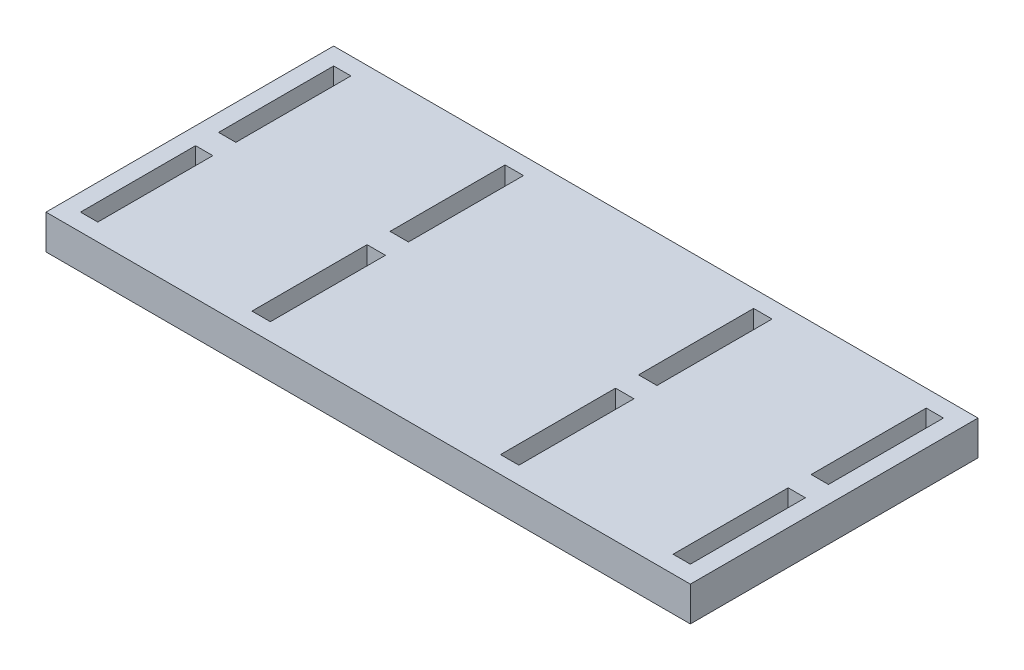
ISO-10303-21;
HEADER;
FILE_DESCRIPTION(('STEP AP214'),'2;1');
FILE_NAME('part.step','',(''),(''),'','','');
FILE_SCHEMA(('AUTOMOTIVE_DESIGN { 1 0 10303 214 1 1 1 1 }'));
ENDSEC;
DATA;
#1=APPLICATION_CONTEXT('core data for automotive mechanical design processes');
#2=APPLICATION_PROTOCOL_DEFINITION('international standard','automotive_design',2000,#1);
#3=PRODUCT_CONTEXT('',#1,'mechanical');
#4=PRODUCT('Part','Part','',(#3));
#5=PRODUCT_RELATED_PRODUCT_CATEGORY('part','',(#4));
#6=PRODUCT_DEFINITION_FORMATION('','',#4);
#7=PRODUCT_DEFINITION_CONTEXT('part definition',#1,'design');
#8=PRODUCT_DEFINITION('design','',#6,#7);
#9=PRODUCT_DEFINITION_SHAPE('','',#8);
#10=(LENGTH_UNIT() NAMED_UNIT(*) SI_UNIT(.MILLI.,.METRE.));
#11=(NAMED_UNIT(*) PLANE_ANGLE_UNIT() SI_UNIT($,.RADIAN.));
#12=(NAMED_UNIT(*) SI_UNIT($,.STERADIAN.) SOLID_ANGLE_UNIT());
#13=UNCERTAINTY_MEASURE_WITH_UNIT(LENGTH_MEASURE(1.E-05),#10,'distance_accuracy_value','');
#14=(GEOMETRIC_REPRESENTATION_CONTEXT(3) GLOBAL_UNCERTAINTY_ASSIGNED_CONTEXT((#13)) GLOBAL_UNIT_ASSIGNED_CONTEXT((#10,
#11,#12)) REPRESENTATION_CONTEXT('',''));
#15=CARTESIAN_POINT('',(0.,0.,0.));
#16=DIRECTION('',(0.,0.,1.));
#17=DIRECTION('',(1.,0.,0.));
#18=AXIS2_PLACEMENT_3D('',#15,#16,#17);
#19=CARTESIAN_POINT('',(1.01915004213638E-13,6.,47.0000000000001));
#20=DIRECTION('',(0.,0.,-1.));
#21=DIRECTION('',(-1.,0.,0.));
#22=AXIS2_PLACEMENT_3D('',#19,#20,#21);
#23=PLANE('',#22);
#24=DIRECTION('',(1.,0.,0.));
#25=VECTOR('',#24,1.);
#26=CARTESIAN_POINT('',(1.01915004213638E-13,0.,47.0000000000001));
#27=LINE('',#26,#25);
#28=CARTESIAN_POINT('',(32.8,0.,47.));
#29=VERTEX_POINT('',#28);
#30=CARTESIAN_POINT('',(36.,0.,47.));
#31=VERTEX_POINT('',#30);
#32=EDGE_CURVE('E556',#29,#31,#27,.T.);
#33=ORIENTED_EDGE('',*,*,#32,.F.);
#34=DIRECTION('',(0.,-1.,0.));
#35=VECTOR('',#34,1.);
#36=CARTESIAN_POINT('',(32.8,6.,47.));
#37=LINE('',#36,#35);
#38=CARTESIAN_POINT('',(32.8,6.,47.));
#39=VERTEX_POINT('',#38);
#40=EDGE_CURVE('E12',#39,#29,#37,.T.);
#41=ORIENTED_EDGE('',*,*,#40,.F.);
#42=DIRECTION('',(1.,0.,0.));
#43=VECTOR('',#42,1.);
#44=CARTESIAN_POINT('',(1.01915004213638E-13,6.,47.0000000000001));
#45=LINE('',#44,#43);
#46=CARTESIAN_POINT('',(36.,6.,47.));
#47=VERTEX_POINT('',#46);
#48=EDGE_CURVE('E304',#39,#47,#45,.T.);
#49=ORIENTED_EDGE('',*,*,#48,.T.);
#50=DIRECTION('',(0.,-1.,0.));
#51=VECTOR('',#50,1.);
#52=CARTESIAN_POINT('',(36.,6.,47.));
#53=LINE('',#52,#51);
#54=EDGE_CURVE('E68',#47,#31,#53,.T.);
#55=ORIENTED_EDGE('',*,*,#54,.T.);
#56=EDGE_LOOP('',(#33,#41,#49,#55));
#57=FACE_BOUND('',#56,.T.);
#58=ADVANCED_FACE('F48',(#57),#23,.T.);
#59=CARTESIAN_POINT('',(32.8,6.,0.));
#60=DIRECTION('',(-1.,0.,0.));
#61=DIRECTION('',(0.,0.,1.));
#62=AXIS2_PLACEMENT_3D('',#59,#60,#61);
#63=PLANE('',#62);
#64=DIRECTION('',(0.,0.,-1.));
#65=VECTOR('',#64,1.);
#66=CARTESIAN_POINT('',(32.8,0.,0.));
#67=LINE('',#66,#65);
#68=CARTESIAN_POINT('',(32.8,0.,27.));
#69=VERTEX_POINT('',#68);
#70=EDGE_CURVE('E310',#29,#69,#67,.T.);
#71=ORIENTED_EDGE('',*,*,#70,.T.);
#72=DIRECTION('',(0.,-1.,0.));
#73=VECTOR('',#72,1.);
#74=CARTESIAN_POINT('',(32.8,6.,27.));
#75=LINE('',#74,#73);
#76=CARTESIAN_POINT('',(32.8,6.,27.));
#77=VERTEX_POINT('',#76);
#78=EDGE_CURVE('E59',#77,#69,#75,.T.);
#79=ORIENTED_EDGE('',*,*,#78,.F.);
#80=DIRECTION('',(0.,0.,-1.));
#81=VECTOR('',#80,1.);
#82=CARTESIAN_POINT('',(32.8,6.,0.));
#83=LINE('',#82,#81);
#84=EDGE_CURVE('E299',#39,#77,#83,.T.);
#85=ORIENTED_EDGE('',*,*,#84,.F.);
#86=ORIENTED_EDGE('',*,*,#40,.T.);
#87=EDGE_LOOP('',(#71,#79,#85,#86));
#88=FACE_BOUND('',#87,.T.);
#89=ADVANCED_FACE('F308',(#88),#63,.F.);
#90=CARTESIAN_POINT('',(0.,6.,27.));
#91=DIRECTION('',(0.,0.,-1.));
#92=DIRECTION('',(-1.,0.,0.));
#93=AXIS2_PLACEMENT_3D('',#90,#91,#92);
#94=PLANE('',#93);
#95=DIRECTION('',(1.,0.,0.));
#96=VECTOR('',#95,1.);
#97=CARTESIAN_POINT('',(0.,0.,27.));
#98=LINE('',#97,#96);
#99=CARTESIAN_POINT('',(36.,0.,27.));
#100=VERTEX_POINT('',#99);
#101=EDGE_CURVE('E561',#69,#100,#98,.T.);
#102=ORIENTED_EDGE('',*,*,#101,.T.);
#103=DIRECTION('',(0.,-1.,0.));
#104=VECTOR('',#103,1.);
#105=CARTESIAN_POINT('',(36.,6.,27.));
#106=LINE('',#105,#104);
#107=CARTESIAN_POINT('',(36.,6.,27.));
#108=VERTEX_POINT('',#107);
#109=EDGE_CURVE('E178',#108,#100,#106,.T.);
#110=ORIENTED_EDGE('',*,*,#109,.F.);
#111=DIRECTION('',(1.,0.,0.));
#112=VECTOR('',#111,1.);
#113=CARTESIAN_POINT('',(0.,6.,27.));
#114=LINE('',#113,#112);
#115=EDGE_CURVE('E290',#77,#108,#114,.T.);
#116=ORIENTED_EDGE('',*,*,#115,.F.);
#117=ORIENTED_EDGE('',*,*,#78,.T.);
#118=EDGE_LOOP('',(#102,#110,#116,#117));
#119=FACE_BOUND('',#118,.T.);
#120=ADVANCED_FACE('F292',(#119),#94,.F.);
#121=CARTESIAN_POINT('',(0.,6.,47.));
#122=DIRECTION('',(0.,0.,-1.));
#123=DIRECTION('',(-1.,0.,0.));
#124=AXIS2_PLACEMENT_3D('',#121,#122,#123);
#125=PLANE('',#124);
#126=DIRECTION('',(1.,0.,0.));
#127=VECTOR('',#126,1.);
#128=CARTESIAN_POINT('',(0.,0.,47.));
#129=LINE('',#128,#127);
#130=CARTESIAN_POINT('',(3.,0.,47.));
#131=VERTEX_POINT('',#130);
#132=CARTESIAN_POINT('',(6.,0.,47.));
#133=VERTEX_POINT('',#132);
#134=EDGE_CURVE('E540',#131,#133,#129,.T.);
#135=ORIENTED_EDGE('',*,*,#134,.F.);
#136=DIRECTION('',(0.,-1.,0.));
#137=VECTOR('',#136,1.);
#138=CARTESIAN_POINT('',(3.,6.,47.));
#139=LINE('',#138,#137);
#140=CARTESIAN_POINT('',(3.,6.,47.));
#141=VERTEX_POINT('',#140);
#142=EDGE_CURVE('E328',#141,#131,#139,.T.);
#143=ORIENTED_EDGE('',*,*,#142,.F.);
#144=DIRECTION('',(1.,0.,0.));
#145=VECTOR('',#144,1.);
#146=CARTESIAN_POINT('',(0.,6.,47.));
#147=LINE('',#146,#145);
#148=CARTESIAN_POINT('',(6.,6.,47.));
#149=VERTEX_POINT('',#148);
#150=EDGE_CURVE('E721',#141,#149,#147,.T.);
#151=ORIENTED_EDGE('',*,*,#150,.T.);
#152=DIRECTION('',(0.,-1.,0.));
#153=VECTOR('',#152,1.);
#154=CARTESIAN_POINT('',(6.,6.,47.));
#155=LINE('',#154,#153);
#156=EDGE_CURVE('E317',#149,#133,#155,.T.);
#157=ORIENTED_EDGE('',*,*,#156,.T.);
#158=EDGE_LOOP('',(#135,#143,#151,#157));
#159=FACE_BOUND('',#158,.T.);
#160=ADVANCED_FACE('F784',(#159),#125,.T.);
#161=CARTESIAN_POINT('',(3.00000000000001,6.,0.));
#162=DIRECTION('',(-1.,0.,0.));
#163=DIRECTION('',(0.,0.,1.));
#164=AXIS2_PLACEMENT_3D('',#161,#162,#163);
#165=PLANE('',#164);
#166=DIRECTION('',(0.,0.,-1.));
#167=VECTOR('',#166,1.);
#168=CARTESIAN_POINT('',(3.00000000000001,0.,0.));
#169=LINE('',#168,#167);
#170=CARTESIAN_POINT('',(3.,0.,27.));
#171=VERTEX_POINT('',#170);
#172=EDGE_CURVE('E544',#131,#171,#169,.T.);
#173=ORIENTED_EDGE('',*,*,#172,.T.);
#174=DIRECTION('',(0.,-1.,0.));
#175=VECTOR('',#174,1.);
#176=CARTESIAN_POINT('',(3.,6.,27.));
#177=LINE('',#176,#175);
#178=CARTESIAN_POINT('',(3.,6.,27.));
#179=VERTEX_POINT('',#178);
#180=EDGE_CURVE('E324',#179,#171,#177,.T.);
#181=ORIENTED_EDGE('',*,*,#180,.F.);
#182=DIRECTION('',(0.,0.,-1.));
#183=VECTOR('',#182,1.);
#184=CARTESIAN_POINT('',(3.00000000000001,6.,0.));
#185=LINE('',#184,#183);
#186=EDGE_CURVE('E726',#141,#179,#185,.T.);
#187=ORIENTED_EDGE('',*,*,#186,.F.);
#188=ORIENTED_EDGE('',*,*,#142,.T.);
#189=EDGE_LOOP('',(#173,#181,#187,#188));
#190=FACE_BOUND('',#189,.T.);
#191=ADVANCED_FACE('F780',(#190),#165,.F.);
#192=CARTESIAN_POINT('',(0.,6.,27.));
#193=DIRECTION('',(0.,0.,-1.));
#194=DIRECTION('',(-1.,0.,0.));
#195=AXIS2_PLACEMENT_3D('',#192,#193,#194);
#196=PLANE('',#195);
#197=DIRECTION('',(1.,0.,0.));
#198=VECTOR('',#197,1.);
#199=CARTESIAN_POINT('',(0.,0.,27.));
#200=LINE('',#199,#198);
#201=CARTESIAN_POINT('',(6.,0.,27.));
#202=VERTEX_POINT('',#201);
#203=EDGE_CURVE('E548',#171,#202,#200,.T.);
#204=ORIENTED_EDGE('',*,*,#203,.T.);
#205=DIRECTION('',(0.,-1.,0.));
#206=VECTOR('',#205,1.);
#207=CARTESIAN_POINT('',(6.,6.,27.));
#208=LINE('',#207,#206);
#209=CARTESIAN_POINT('',(6.,6.,27.));
#210=VERTEX_POINT('',#209);
#211=EDGE_CURVE('E320',#210,#202,#208,.T.);
#212=ORIENTED_EDGE('',*,*,#211,.F.);
#213=DIRECTION('',(1.,0.,0.));
#214=VECTOR('',#213,1.);
#215=CARTESIAN_POINT('',(0.,6.,27.));
#216=LINE('',#215,#214);
#217=EDGE_CURVE('E734',#179,#210,#216,.T.);
#218=ORIENTED_EDGE('',*,*,#217,.F.);
#219=ORIENTED_EDGE('',*,*,#180,.T.);
#220=EDGE_LOOP('',(#204,#212,#218,#219));
#221=FACE_BOUND('',#220,.T.);
#222=ADVANCED_FACE('F776',(#221),#196,.F.);
#223=CARTESIAN_POINT('',(0.,6.,3.00000000000001));
#224=DIRECTION('',(0.,0.,1.));
#225=DIRECTION('',(1.,0.,0.));
#226=AXIS2_PLACEMENT_3D('',#223,#224,#225);
#227=PLANE('',#226);
#228=DIRECTION('',(-1.,0.,0.));
#229=VECTOR('',#228,1.);
#230=CARTESIAN_POINT('',(0.,0.,3.00000000000001));
#231=LINE('',#230,#229);
#232=CARTESIAN_POINT('',(79.2,0.,2.99999999999999));
#233=VERTEX_POINT('',#232);
#234=CARTESIAN_POINT('',(76.,0.,2.99999999999999));
#235=VERTEX_POINT('',#234);
#236=EDGE_CURVE('E524',#233,#235,#231,.T.);
#237=ORIENTED_EDGE('',*,*,#236,.F.);
#238=DIRECTION('',(0.,-1.,0.));
#239=VECTOR('',#238,1.);
#240=CARTESIAN_POINT('',(79.2,6.,2.99999999999999));
#241=LINE('',#240,#239);
#242=CARTESIAN_POINT('',(79.2,6.,2.99999999999999));
#243=VERTEX_POINT('',#242);
#244=EDGE_CURVE('E321',#243,#233,#241,.T.);
#245=ORIENTED_EDGE('',*,*,#244,.F.);
#246=DIRECTION('',(-1.,0.,0.));
#247=VECTOR('',#246,1.);
#248=CARTESIAN_POINT('',(0.,6.,3.00000000000001));
#249=LINE('',#248,#247);
#250=CARTESIAN_POINT('',(76.,6.,2.99999999999999));
#251=VERTEX_POINT('',#250);
#252=EDGE_CURVE('E700',#243,#251,#249,.T.);
#253=ORIENTED_EDGE('',*,*,#252,.T.);
#254=DIRECTION('',(0.,-1.,0.));
#255=VECTOR('',#254,1.);
#256=CARTESIAN_POINT('',(76.,6.,2.99999999999999));
#257=LINE('',#256,#255);
#258=EDGE_CURVE('E331',#251,#235,#257,.T.);
#259=ORIENTED_EDGE('',*,*,#258,.T.);
#260=EDGE_LOOP('',(#237,#245,#253,#259));
#261=FACE_BOUND('',#260,.T.);
#262=ADVANCED_FACE('F779',(#261),#227,.T.);
#263=CARTESIAN_POINT('',(79.2,6.,0.));
#264=DIRECTION('',(1.,0.,0.));
#265=DIRECTION('',(0.,0.,-1.));
#266=AXIS2_PLACEMENT_3D('',#263,#264,#265);
#267=PLANE('',#266);
#268=DIRECTION('',(0.,0.,1.));
#269=VECTOR('',#268,1.);
#270=CARTESIAN_POINT('',(79.2,0.,0.));
#271=LINE('',#270,#269);
#272=CARTESIAN_POINT('',(79.2,0.,23.));
#273=VERTEX_POINT('',#272);
#274=EDGE_CURVE('E528',#233,#273,#271,.T.);
#275=ORIENTED_EDGE('',*,*,#274,.T.);
#276=DIRECTION('',(0.,-1.,0.));
#277=VECTOR('',#276,1.);
#278=CARTESIAN_POINT('',(79.2,6.,23.));
#279=LINE('',#278,#277);
#280=CARTESIAN_POINT('',(79.2,6.,23.));
#281=VERTEX_POINT('',#280);
#282=EDGE_CURVE('E338',#281,#273,#279,.T.);
#283=ORIENTED_EDGE('',*,*,#282,.F.);
#284=DIRECTION('',(0.,0.,1.));
#285=VECTOR('',#284,1.);
#286=CARTESIAN_POINT('',(79.2,6.,0.));
#287=LINE('',#286,#285);
#288=EDGE_CURVE('E705',#243,#281,#287,.T.);
#289=ORIENTED_EDGE('',*,*,#288,.F.);
#290=ORIENTED_EDGE('',*,*,#244,.T.);
#291=EDGE_LOOP('',(#275,#283,#289,#290));
#292=FACE_BOUND('',#291,.T.);
#293=ADVANCED_FACE('F797',(#292),#267,.F.);
#294=CARTESIAN_POINT('',(0.,6.,23.));
#295=DIRECTION('',(0.,0.,1.));
#296=DIRECTION('',(1.,0.,0.));
#297=AXIS2_PLACEMENT_3D('',#294,#295,#296);
#298=PLANE('',#297);
#299=DIRECTION('',(-1.,0.,0.));
#300=VECTOR('',#299,1.);
#301=CARTESIAN_POINT('',(0.,0.,23.));
#302=LINE('',#301,#300);
#303=CARTESIAN_POINT('',(76.,0.,23.));
#304=VERTEX_POINT('',#303);
#305=EDGE_CURVE('E532',#273,#304,#302,.T.);
#306=ORIENTED_EDGE('',*,*,#305,.T.);
#307=DIRECTION('',(0.,-1.,0.));
#308=VECTOR('',#307,1.);
#309=CARTESIAN_POINT('',(76.,6.,23.));
#310=LINE('',#309,#308);
#311=CARTESIAN_POINT('',(76.,6.,23.));
#312=VERTEX_POINT('',#311);
#313=EDGE_CURVE('E334',#312,#304,#310,.T.);
#314=ORIENTED_EDGE('',*,*,#313,.F.);
#315=DIRECTION('',(-1.,0.,0.));
#316=VECTOR('',#315,1.);
#317=CARTESIAN_POINT('',(0.,6.,23.));
#318=LINE('',#317,#316);
#319=EDGE_CURVE('E713',#281,#312,#318,.T.);
#320=ORIENTED_EDGE('',*,*,#319,.F.);
#321=ORIENTED_EDGE('',*,*,#282,.T.);
#322=EDGE_LOOP('',(#306,#314,#320,#321));
#323=FACE_BOUND('',#322,.T.);
#324=ADVANCED_FACE('F793',(#323),#298,.F.);
#325=CARTESIAN_POINT('',(0.,6.,3.00000000000002));
#326=DIRECTION('',(0.,0.,1.));
#327=DIRECTION('',(1.,0.,0.));
#328=AXIS2_PLACEMENT_3D('',#325,#326,#327);
#329=PLANE('',#328);
#330=DIRECTION('',(-1.,0.,0.));
#331=VECTOR('',#330,1.);
#332=CARTESIAN_POINT('',(0.,0.,3.00000000000002));
#333=LINE('',#332,#331);
#334=CARTESIAN_POINT('',(109.,0.,2.99999999999999));
#335=VERTEX_POINT('',#334);
#336=CARTESIAN_POINT('',(106.,0.,2.99999999999999));
#337=VERTEX_POINT('',#336);
#338=EDGE_CURVE('E508',#335,#337,#333,.T.);
#339=ORIENTED_EDGE('',*,*,#338,.F.);
#340=DIRECTION('',(0.,-1.,0.));
#341=VECTOR('',#340,1.);
#342=CARTESIAN_POINT('',(109.,6.,2.99999999999999));
#343=LINE('',#342,#341);
#344=CARTESIAN_POINT('',(109.,6.,2.99999999999999));
#345=VERTEX_POINT('',#344);
#346=EDGE_CURVE('E335',#345,#335,#343,.T.);
#347=ORIENTED_EDGE('',*,*,#346,.F.);
#348=DIRECTION('',(-1.,0.,0.));
#349=VECTOR('',#348,1.);
#350=CARTESIAN_POINT('',(0.,6.,3.00000000000002));
#351=LINE('',#350,#349);
#352=CARTESIAN_POINT('',(106.,6.,2.99999999999999));
#353=VERTEX_POINT('',#352);
#354=EDGE_CURVE('E679',#345,#353,#351,.T.);
#355=ORIENTED_EDGE('',*,*,#354,.T.);
#356=DIRECTION('',(0.,-1.,0.));
#357=VECTOR('',#356,1.);
#358=CARTESIAN_POINT('',(106.,6.,2.99999999999999));
#359=LINE('',#358,#357);
#360=EDGE_CURVE('E344',#353,#337,#359,.T.);
#361=ORIENTED_EDGE('',*,*,#360,.T.);
#362=EDGE_LOOP('',(#339,#347,#355,#361));
#363=FACE_BOUND('',#362,.T.);
#364=ADVANCED_FACE('F796',(#363),#329,.T.);
#365=CARTESIAN_POINT('',(109.,6.,0.));
#366=DIRECTION('',(1.,0.,0.));
#367=DIRECTION('',(0.,0.,-1.));
#368=AXIS2_PLACEMENT_3D('',#365,#366,#367);
#369=PLANE('',#368);
#370=DIRECTION('',(0.,0.,1.));
#371=VECTOR('',#370,1.);
#372=CARTESIAN_POINT('',(109.,0.,0.));
#373=LINE('',#372,#371);
#374=CARTESIAN_POINT('',(109.,0.,23.));
#375=VERTEX_POINT('',#374);
#376=EDGE_CURVE('E512',#335,#375,#373,.T.);
#377=ORIENTED_EDGE('',*,*,#376,.T.);
#378=DIRECTION('',(0.,-1.,0.));
#379=VECTOR('',#378,1.);
#380=CARTESIAN_POINT('',(109.,6.,23.));
#381=LINE('',#380,#379);
#382=CARTESIAN_POINT('',(109.,6.,23.));
#383=VERTEX_POINT('',#382);
#384=EDGE_CURVE('E351',#383,#375,#381,.T.);
#385=ORIENTED_EDGE('',*,*,#384,.F.);
#386=DIRECTION('',(0.,0.,1.));
#387=VECTOR('',#386,1.);
#388=CARTESIAN_POINT('',(109.,6.,0.));
#389=LINE('',#388,#387);
#390=EDGE_CURVE('E684',#345,#383,#389,.T.);
#391=ORIENTED_EDGE('',*,*,#390,.F.);
#392=ORIENTED_EDGE('',*,*,#346,.T.);
#393=EDGE_LOOP('',(#377,#385,#391,#392));
#394=FACE_BOUND('',#393,.T.);
#395=ADVANCED_FACE('F813',(#394),#369,.F.);
#396=CARTESIAN_POINT('',(0.,6.,23.));
#397=DIRECTION('',(0.,0.,1.));
#398=DIRECTION('',(1.,0.,0.));
#399=AXIS2_PLACEMENT_3D('',#396,#397,#398);
#400=PLANE('',#399);
#401=DIRECTION('',(-1.,0.,0.));
#402=VECTOR('',#401,1.);
#403=CARTESIAN_POINT('',(0.,0.,23.));
#404=LINE('',#403,#402);
#405=CARTESIAN_POINT('',(106.,0.,23.));
#406=VERTEX_POINT('',#405);
#407=EDGE_CURVE('E516',#375,#406,#404,.T.);
#408=ORIENTED_EDGE('',*,*,#407,.T.);
#409=DIRECTION('',(0.,-1.,0.));
#410=VECTOR('',#409,1.);
#411=CARTESIAN_POINT('',(106.,6.,23.));
#412=LINE('',#411,#410);
#413=CARTESIAN_POINT('',(106.,6.,23.));
#414=VERTEX_POINT('',#413);
#415=EDGE_CURVE('E347',#414,#406,#412,.T.);
#416=ORIENTED_EDGE('',*,*,#415,.F.);
#417=DIRECTION('',(-1.,0.,0.));
#418=VECTOR('',#417,1.);
#419=CARTESIAN_POINT('',(0.,6.,23.));
#420=LINE('',#419,#418);
#421=EDGE_CURVE('E692',#383,#414,#420,.T.);
#422=ORIENTED_EDGE('',*,*,#421,.F.);
#423=ORIENTED_EDGE('',*,*,#384,.T.);
#424=EDGE_LOOP('',(#408,#416,#422,#423));
#425=FACE_BOUND('',#424,.T.);
#426=ADVANCED_FACE('F809',(#425),#400,.F.);
#427=CARTESIAN_POINT('',(0.,6.,27.));
#428=DIRECTION('',(0.,0.,1.));
#429=DIRECTION('',(1.,0.,0.));
#430=AXIS2_PLACEMENT_3D('',#427,#428,#429);
#431=PLANE('',#430);
#432=DIRECTION('',(-1.,0.,0.));
#433=VECTOR('',#432,1.);
#434=CARTESIAN_POINT('',(0.,0.,27.));
#435=LINE('',#434,#433);
#436=CARTESIAN_POINT('',(109.,0.,27.));
#437=VERTEX_POINT('',#436);
#438=CARTESIAN_POINT('',(106.,0.,27.));
#439=VERTEX_POINT('',#438);
#440=EDGE_CURVE('E492',#437,#439,#435,.T.);
#441=ORIENTED_EDGE('',*,*,#440,.F.);
#442=DIRECTION('',(0.,-1.,0.));
#443=VECTOR('',#442,1.);
#444=CARTESIAN_POINT('',(109.,6.,27.));
#445=LINE('',#444,#443);
#446=CARTESIAN_POINT('',(109.,6.,27.));
#447=VERTEX_POINT('',#446);
#448=EDGE_CURVE('E348',#447,#437,#445,.T.);
#449=ORIENTED_EDGE('',*,*,#448,.F.);
#450=DIRECTION('',(-1.,0.,0.));
#451=VECTOR('',#450,1.);
#452=CARTESIAN_POINT('',(0.,6.,27.));
#453=LINE('',#452,#451);
#454=CARTESIAN_POINT('',(106.,6.,27.));
#455=VERTEX_POINT('',#454);
#456=EDGE_CURVE('E658',#447,#455,#453,.T.);
#457=ORIENTED_EDGE('',*,*,#456,.T.);
#458=DIRECTION('',(0.,-1.,0.));
#459=VECTOR('',#458,1.);
#460=CARTESIAN_POINT('',(106.,6.,27.));
#461=LINE('',#460,#459);
#462=EDGE_CURVE('E357',#455,#439,#461,.T.);
#463=ORIENTED_EDGE('',*,*,#462,.T.);
#464=EDGE_LOOP('',(#441,#449,#457,#463));
#465=FACE_BOUND('',#464,.T.);
#466=ADVANCED_FACE('F812',(#465),#431,.T.);
#467=CARTESIAN_POINT('',(109.,6.,0.));
#468=DIRECTION('',(-1.,0.,0.));
#469=DIRECTION('',(0.,0.,1.));
#470=AXIS2_PLACEMENT_3D('',#467,#468,#469);
#471=PLANE('',#470);
#472=DIRECTION('',(0.,0.,-1.));
#473=VECTOR('',#472,1.);
#474=CARTESIAN_POINT('',(109.,0.,0.));
#475=LINE('',#474,#473);
#476=CARTESIAN_POINT('',(109.,0.,47.));
#477=VERTEX_POINT('',#476);
#478=EDGE_CURVE('E496',#477,#437,#475,.T.);
#479=ORIENTED_EDGE('',*,*,#478,.F.);
#480=DIRECTION('',(0.,-1.,0.));
#481=VECTOR('',#480,1.);
#482=CARTESIAN_POINT('',(109.,6.,47.));
#483=LINE('',#482,#481);
#484=CARTESIAN_POINT('',(109.,6.,47.));
#485=VERTEX_POINT('',#484);
#486=EDGE_CURVE('E365',#485,#477,#483,.T.);
#487=ORIENTED_EDGE('',*,*,#486,.F.);
#488=DIRECTION('',(0.,0.,-1.));
#489=VECTOR('',#488,1.);
#490=CARTESIAN_POINT('',(109.,6.,0.));
#491=LINE('',#490,#489);
#492=EDGE_CURVE('E663',#485,#447,#491,.T.);
#493=ORIENTED_EDGE('',*,*,#492,.T.);
#494=ORIENTED_EDGE('',*,*,#448,.T.);
#495=EDGE_LOOP('',(#479,#487,#493,#494));
#496=FACE_BOUND('',#495,.T.);
#497=ADVANCED_FACE('F829',(#496),#471,.T.);
#498=CARTESIAN_POINT('',(0.,6.,47.));
#499=DIRECTION('',(0.,0.,1.));
#500=DIRECTION('',(1.,0.,0.));
#501=AXIS2_PLACEMENT_3D('',#498,#499,#500);
#502=PLANE('',#501);
#503=DIRECTION('',(-1.,0.,0.));
#504=VECTOR('',#503,1.);
#505=CARTESIAN_POINT('',(0.,0.,47.));
#506=LINE('',#505,#504);
#507=CARTESIAN_POINT('',(106.,0.,47.));
#508=VERTEX_POINT('',#507);
#509=EDGE_CURVE('E500',#477,#508,#506,.T.);
#510=ORIENTED_EDGE('',*,*,#509,.T.);
#511=DIRECTION('',(0.,-1.,0.));
#512=VECTOR('',#511,1.);
#513=CARTESIAN_POINT('',(106.,6.,47.));
#514=LINE('',#513,#512);
#515=CARTESIAN_POINT('',(106.,6.,47.));
#516=VERTEX_POINT('',#515);
#517=EDGE_CURVE('E360',#516,#508,#514,.T.);
#518=ORIENTED_EDGE('',*,*,#517,.F.);
#519=DIRECTION('',(-1.,0.,0.));
#520=VECTOR('',#519,1.);
#521=CARTESIAN_POINT('',(0.,6.,47.));
#522=LINE('',#521,#520);
#523=EDGE_CURVE('E671',#485,#516,#522,.T.);
#524=ORIENTED_EDGE('',*,*,#523,.F.);
#525=ORIENTED_EDGE('',*,*,#486,.T.);
#526=EDGE_LOOP('',(#510,#518,#524,#525));
#527=FACE_BOUND('',#526,.T.);
#528=ADVANCED_FACE('F825',(#527),#502,.F.);
#529=CARTESIAN_POINT('',(0.,6.,27.));
#530=DIRECTION('',(0.,0.,1.));
#531=DIRECTION('',(1.,0.,0.));
#532=AXIS2_PLACEMENT_3D('',#529,#530,#531);
#533=PLANE('',#532);
#534=DIRECTION('',(-1.,0.,0.));
#535=VECTOR('',#534,1.);
#536=CARTESIAN_POINT('',(0.,0.,27.));
#537=LINE('',#536,#535);
#538=CARTESIAN_POINT('',(79.2,0.,27.));
#539=VERTEX_POINT('',#538);
#540=CARTESIAN_POINT('',(76.,0.,27.));
#541=VERTEX_POINT('',#540);
#542=EDGE_CURVE('E476',#539,#541,#537,.T.);
#543=ORIENTED_EDGE('',*,*,#542,.F.);
#544=DIRECTION('',(0.,-1.,0.));
#545=VECTOR('',#544,1.);
#546=CARTESIAN_POINT('',(79.2,6.,27.));
#547=LINE('',#546,#545);
#548=CARTESIAN_POINT('',(79.2,6.,27.));
#549=VERTEX_POINT('',#548);
#550=EDGE_CURVE('E361',#549,#539,#547,.T.);
#551=ORIENTED_EDGE('',*,*,#550,.F.);
#552=DIRECTION('',(-1.,0.,0.));
#553=VECTOR('',#552,1.);
#554=CARTESIAN_POINT('',(0.,6.,27.));
#555=LINE('',#554,#553);
#556=CARTESIAN_POINT('',(76.,6.,27.));
#557=VERTEX_POINT('',#556);
#558=EDGE_CURVE('E637',#549,#557,#555,.T.);
#559=ORIENTED_EDGE('',*,*,#558,.T.);
#560=DIRECTION('',(0.,-1.,0.));
#561=VECTOR('',#560,1.);
#562=CARTESIAN_POINT('',(76.,6.,27.));
#563=LINE('',#562,#561);
#564=EDGE_CURVE('E370',#557,#541,#563,.T.);
#565=ORIENTED_EDGE('',*,*,#564,.T.);
#566=EDGE_LOOP('',(#543,#551,#559,#565));
#567=FACE_BOUND('',#566,.T.);
#568=ADVANCED_FACE('F828',(#567),#533,.T.);
#569=CARTESIAN_POINT('',(79.2,6.,0.));
#570=DIRECTION('',(-1.,0.,0.));
#571=DIRECTION('',(0.,0.,1.));
#572=AXIS2_PLACEMENT_3D('',#569,#570,#571);
#573=PLANE('',#572);
#574=DIRECTION('',(0.,0.,-1.));
#575=VECTOR('',#574,1.);
#576=CARTESIAN_POINT('',(79.2,0.,0.));
#577=LINE('',#576,#575);
#578=CARTESIAN_POINT('',(79.2,0.,47.));
#579=VERTEX_POINT('',#578);
#580=EDGE_CURVE('E480',#579,#539,#577,.T.);
#581=ORIENTED_EDGE('',*,*,#580,.F.);
#582=DIRECTION('',(0.,-1.,0.));
#583=VECTOR('',#582,1.);
#584=CARTESIAN_POINT('',(79.2,6.,47.));
#585=LINE('',#584,#583);
#586=CARTESIAN_POINT('',(79.2,6.,47.));
#587=VERTEX_POINT('',#586);
#588=EDGE_CURVE('E378',#587,#579,#585,.T.);
#589=ORIENTED_EDGE('',*,*,#588,.F.);
#590=DIRECTION('',(0.,0.,-1.));
#591=VECTOR('',#590,1.);
#592=CARTESIAN_POINT('',(79.2,6.,0.));
#593=LINE('',#592,#591);
#594=EDGE_CURVE('E642',#587,#549,#593,.T.);
#595=ORIENTED_EDGE('',*,*,#594,.T.);
#596=ORIENTED_EDGE('',*,*,#550,.T.);
#597=EDGE_LOOP('',(#581,#589,#595,#596));
#598=FACE_BOUND('',#597,.T.);
#599=ADVANCED_FACE('F845',(#598),#573,.T.);
#600=CARTESIAN_POINT('',(0.,6.,47.));
#601=DIRECTION('',(0.,0.,1.));
#602=DIRECTION('',(1.,0.,0.));
#603=AXIS2_PLACEMENT_3D('',#600,#601,#602);
#604=PLANE('',#603);
#605=DIRECTION('',(-1.,0.,0.));
#606=VECTOR('',#605,1.);
#607=CARTESIAN_POINT('',(0.,0.,47.));
#608=LINE('',#607,#606);
#609=CARTESIAN_POINT('',(76.,0.,47.));
#610=VERTEX_POINT('',#609);
#611=EDGE_CURVE('E484',#579,#610,#608,.T.);
#612=ORIENTED_EDGE('',*,*,#611,.T.);
#613=DIRECTION('',(0.,-1.,0.));
#614=VECTOR('',#613,1.);
#615=CARTESIAN_POINT('',(76.,6.,47.));
#616=LINE('',#615,#614);
#617=CARTESIAN_POINT('',(76.,6.,47.));
#618=VERTEX_POINT('',#617);
#619=EDGE_CURVE('E373',#618,#610,#616,.T.);
#620=ORIENTED_EDGE('',*,*,#619,.F.);
#621=DIRECTION('',(-1.,0.,0.));
#622=VECTOR('',#621,1.);
#623=CARTESIAN_POINT('',(0.,6.,47.));
#624=LINE('',#623,#622);
#625=EDGE_CURVE('E650',#587,#618,#624,.T.);
#626=ORIENTED_EDGE('',*,*,#625,.F.);
#627=ORIENTED_EDGE('',*,*,#588,.T.);
#628=EDGE_LOOP('',(#612,#620,#626,#627));
#629=FACE_BOUND('',#628,.T.);
#630=ADVANCED_FACE('F841',(#629),#604,.F.);
#631=CARTESIAN_POINT('',(0.,6.,2.99999999999999));
#632=DIRECTION('',(0.,0.,-1.));
#633=DIRECTION('',(-1.,0.,0.));
#634=AXIS2_PLACEMENT_3D('',#631,#632,#633);
#635=PLANE('',#634);
#636=DIRECTION('',(1.,0.,0.));
#637=VECTOR('',#636,1.);
#638=CARTESIAN_POINT('',(0.,0.,2.99999999999999));
#639=LINE('',#638,#637);
#640=CARTESIAN_POINT('',(32.8,0.,3.));
#641=VERTEX_POINT('',#640);
#642=CARTESIAN_POINT('',(36.,0.,3.));
#643=VERTEX_POINT('',#642);
#644=EDGE_CURVE('E460',#641,#643,#639,.T.);
#645=ORIENTED_EDGE('',*,*,#644,.T.);
#646=DIRECTION('',(0.,-1.,0.));
#647=VECTOR('',#646,1.);
#648=CARTESIAN_POINT('',(36.,6.,3.));
#649=LINE('',#648,#647);
#650=CARTESIAN_POINT('',(36.,6.,3.));
#651=VERTEX_POINT('',#650);
#652=EDGE_CURVE('E374',#651,#643,#649,.T.);
#653=ORIENTED_EDGE('',*,*,#652,.F.);
#654=DIRECTION('',(1.,0.,0.));
#655=VECTOR('',#654,1.);
#656=CARTESIAN_POINT('',(0.,6.,2.99999999999999));
#657=LINE('',#656,#655);
#658=CARTESIAN_POINT('',(32.8,6.,3.));
#659=VERTEX_POINT('',#658);
#660=EDGE_CURVE('E615',#659,#651,#657,.T.);
#661=ORIENTED_EDGE('',*,*,#660,.F.);
#662=DIRECTION('',(0.,-1.,0.));
#663=VECTOR('',#662,1.);
#664=CARTESIAN_POINT('',(32.8,6.,3.));
#665=LINE('',#664,#663);
#666=EDGE_CURVE('E383',#659,#641,#665,.T.);
#667=ORIENTED_EDGE('',*,*,#666,.T.);
#668=EDGE_LOOP('',(#645,#653,#661,#667));
#669=FACE_BOUND('',#668,.T.);
#670=ADVANCED_FACE('F844',(#669),#635,.F.);
#671=CARTESIAN_POINT('',(36.,6.,0.));
#672=DIRECTION('',(1.,0.,0.));
#673=DIRECTION('',(0.,0.,-1.));
#674=AXIS2_PLACEMENT_3D('',#671,#672,#673);
#675=PLANE('',#674);
#676=DIRECTION('',(0.,0.,1.));
#677=VECTOR('',#676,1.);
#678=CARTESIAN_POINT('',(36.,0.,0.));
#679=LINE('',#678,#677);
#680=CARTESIAN_POINT('',(36.,0.,23.));
#681=VERTEX_POINT('',#680);
#682=EDGE_CURVE('E464',#643,#681,#679,.T.);
#683=ORIENTED_EDGE('',*,*,#682,.T.);
#684=DIRECTION('',(0.,-1.,0.));
#685=VECTOR('',#684,1.);
#686=CARTESIAN_POINT('',(36.,6.,23.));
#687=LINE('',#686,#685);
#688=CARTESIAN_POINT('',(36.,6.,23.));
#689=VERTEX_POINT('',#688);
#690=EDGE_CURVE('E390',#689,#681,#687,.T.);
#691=ORIENTED_EDGE('',*,*,#690,.F.);
#692=DIRECTION('',(0.,0.,1.));
#693=VECTOR('',#692,1.);
#694=CARTESIAN_POINT('',(36.,6.,0.));
#695=LINE('',#694,#693);
#696=EDGE_CURVE('E620',#651,#689,#695,.T.);
#697=ORIENTED_EDGE('',*,*,#696,.F.);
#698=ORIENTED_EDGE('',*,*,#652,.T.);
#699=EDGE_LOOP('',(#683,#691,#697,#698));
#700=FACE_BOUND('',#699,.T.);
#701=ADVANCED_FACE('F860',(#700),#675,.F.);
#702=CARTESIAN_POINT('',(0.,6.,23.));
#703=DIRECTION('',(0.,0.,-1.));
#704=DIRECTION('',(-1.,0.,0.));
#705=AXIS2_PLACEMENT_3D('',#702,#703,#704);
#706=PLANE('',#705);
#707=DIRECTION('',(1.,0.,0.));
#708=VECTOR('',#707,1.);
#709=CARTESIAN_POINT('',(0.,0.,23.));
#710=LINE('',#709,#708);
#711=CARTESIAN_POINT('',(32.8,0.,23.));
#712=VERTEX_POINT('',#711);
#713=EDGE_CURVE('E468',#712,#681,#710,.T.);
#714=ORIENTED_EDGE('',*,*,#713,.F.);
#715=DIRECTION('',(0.,-1.,0.));
#716=VECTOR('',#715,1.);
#717=CARTESIAN_POINT('',(32.8,6.,23.));
#718=LINE('',#717,#716);
#719=CARTESIAN_POINT('',(32.8,6.,23.));
#720=VERTEX_POINT('',#719);
#721=EDGE_CURVE('E386',#720,#712,#718,.T.);
#722=ORIENTED_EDGE('',*,*,#721,.F.);
#723=DIRECTION('',(1.,0.,0.));
#724=VECTOR('',#723,1.);
#725=CARTESIAN_POINT('',(0.,6.,23.));
#726=LINE('',#725,#724);
#727=EDGE_CURVE('E628',#720,#689,#726,.T.);
#728=ORIENTED_EDGE('',*,*,#727,.T.);
#729=ORIENTED_EDGE('',*,*,#690,.T.);
#730=EDGE_LOOP('',(#714,#722,#728,#729));
#731=FACE_BOUND('',#730,.T.);
#732=ADVANCED_FACE('F856',(#731),#706,.T.);
#733=CARTESIAN_POINT('',(0.,6.,3.));
#734=DIRECTION('',(0.,0.,-1.));
#735=DIRECTION('',(-1.,0.,0.));
#736=AXIS2_PLACEMENT_3D('',#733,#734,#735);
#737=PLANE('',#736);
#738=DIRECTION('',(1.,0.,0.));
#739=VECTOR('',#738,1.);
#740=CARTESIAN_POINT('',(0.,0.,3.));
#741=LINE('',#740,#739);
#742=CARTESIAN_POINT('',(3.,0.,3.));
#743=VERTEX_POINT('',#742);
#744=CARTESIAN_POINT('',(6.,0.,3.));
#745=VERTEX_POINT('',#744);
#746=EDGE_CURVE('E444',#743,#745,#741,.T.);
#747=ORIENTED_EDGE('',*,*,#746,.T.);
#748=DIRECTION('',(0.,-1.,0.));
#749=VECTOR('',#748,1.);
#750=CARTESIAN_POINT('',(6.,6.,3.));
#751=LINE('',#750,#749);
#752=CARTESIAN_POINT('',(6.,6.,3.));
#753=VERTEX_POINT('',#752);
#754=EDGE_CURVE('E387',#753,#745,#751,.T.);
#755=ORIENTED_EDGE('',*,*,#754,.F.);
#756=DIRECTION('',(1.,0.,0.));
#757=VECTOR('',#756,1.);
#758=CARTESIAN_POINT('',(0.,6.,3.));
#759=LINE('',#758,#757);
#760=CARTESIAN_POINT('',(3.,6.,3.));
#761=VERTEX_POINT('',#760);
#762=EDGE_CURVE('E593',#761,#753,#759,.T.);
#763=ORIENTED_EDGE('',*,*,#762,.F.);
#764=DIRECTION('',(0.,-1.,0.));
#765=VECTOR('',#764,1.);
#766=CARTESIAN_POINT('',(3.,6.,3.));
#767=LINE('',#766,#765);
#768=EDGE_CURVE('E396',#761,#743,#767,.T.);
#769=ORIENTED_EDGE('',*,*,#768,.T.);
#770=EDGE_LOOP('',(#747,#755,#763,#769));
#771=FACE_BOUND('',#770,.T.);
#772=ADVANCED_FACE('F859',(#771),#737,.F.);
#773=CARTESIAN_POINT('',(6.,6.,0.));
#774=DIRECTION('',(1.,0.,0.));
#775=DIRECTION('',(0.,0.,-1.));
#776=AXIS2_PLACEMENT_3D('',#773,#774,#775);
#777=PLANE('',#776);
#778=DIRECTION('',(0.,0.,1.));
#779=VECTOR('',#778,1.);
#780=CARTESIAN_POINT('',(6.,0.,0.));
#781=LINE('',#780,#779);
#782=CARTESIAN_POINT('',(6.,0.,23.));
#783=VERTEX_POINT('',#782);
#784=EDGE_CURVE('E448',#745,#783,#781,.T.);
#785=ORIENTED_EDGE('',*,*,#784,.T.);
#786=DIRECTION('',(0.,-1.,0.));
#787=VECTOR('',#786,1.);
#788=CARTESIAN_POINT('',(6.,6.,23.));
#789=LINE('',#788,#787);
#790=CARTESIAN_POINT('',(6.,6.,23.));
#791=VERTEX_POINT('',#790);
#792=EDGE_CURVE('E402',#791,#783,#789,.T.);
#793=ORIENTED_EDGE('',*,*,#792,.F.);
#794=DIRECTION('',(0.,0.,1.));
#795=VECTOR('',#794,1.);
#796=CARTESIAN_POINT('',(6.,6.,0.));
#797=LINE('',#796,#795);
#798=EDGE_CURVE('E598',#753,#791,#797,.T.);
#799=ORIENTED_EDGE('',*,*,#798,.F.);
#800=ORIENTED_EDGE('',*,*,#754,.T.);
#801=EDGE_LOOP('',(#785,#793,#799,#800));
#802=FACE_BOUND('',#801,.T.);
#803=ADVANCED_FACE('F874',(#802),#777,.F.);
#804=CARTESIAN_POINT('',(0.,6.,23.));
#805=DIRECTION('',(0.,0.,-1.));
#806=DIRECTION('',(-1.,0.,0.));
#807=AXIS2_PLACEMENT_3D('',#804,#805,#806);
#808=PLANE('',#807);
#809=DIRECTION('',(1.,0.,0.));
#810=VECTOR('',#809,1.);
#811=CARTESIAN_POINT('',(0.,0.,23.));
#812=LINE('',#811,#810);
#813=CARTESIAN_POINT('',(3.,0.,23.));
#814=VERTEX_POINT('',#813);
#815=EDGE_CURVE('E452',#814,#783,#812,.T.);
#816=ORIENTED_EDGE('',*,*,#815,.F.);
#817=DIRECTION('',(0.,-1.,0.));
#818=VECTOR('',#817,1.);
#819=CARTESIAN_POINT('',(3.,6.,23.));
#820=LINE('',#819,#818);
#821=CARTESIAN_POINT('',(3.,6.,23.));
#822=VERTEX_POINT('',#821);
#823=EDGE_CURVE('E399',#822,#814,#820,.T.);
#824=ORIENTED_EDGE('',*,*,#823,.F.);
#825=DIRECTION('',(1.,0.,0.));
#826=VECTOR('',#825,1.);
#827=CARTESIAN_POINT('',(0.,6.,23.));
#828=LINE('',#827,#826);
#829=EDGE_CURVE('E606',#822,#791,#828,.T.);
#830=ORIENTED_EDGE('',*,*,#829,.T.);
#831=ORIENTED_EDGE('',*,*,#792,.T.);
#832=EDGE_LOOP('',(#816,#824,#830,#831));
#833=FACE_BOUND('',#832,.T.);
#834=ADVANCED_FACE('F871',(#833),#808,.T.);
#835=CARTESIAN_POINT('',(0.,6.,0.));
#836=DIRECTION('',(1.,0.,0.));
#837=DIRECTION('',(0.,0.,-1.));
#838=AXIS2_PLACEMENT_3D('',#835,#836,#837);
#839=PLANE('',#838);
#840=DIRECTION('',(0.,0.,1.));
#841=VECTOR('',#840,1.);
#842=CARTESIAN_POINT('',(0.,0.,0.));
#843=LINE('',#842,#841);
#844=CARTESIAN_POINT('',(0.,0.,0.));
#845=VERTEX_POINT('',#844);
#846=CARTESIAN_POINT('',(0.,0.,50.));
#847=VERTEX_POINT('',#846);
#848=EDGE_CURVE('E428',#845,#847,#843,.T.);
#849=ORIENTED_EDGE('',*,*,#848,.T.);
#850=DIRECTION('',(0.,-1.,0.));
#851=VECTOR('',#850,1.);
#852=CARTESIAN_POINT('',(0.,6.,50.));
#853=LINE('',#852,#851);
#854=CARTESIAN_POINT('',(0.,6.,50.));
#855=VERTEX_POINT('',#854);
#856=EDGE_CURVE('E52',#855,#847,#853,.T.);
#857=ORIENTED_EDGE('',*,*,#856,.F.);
#858=DIRECTION('',(0.,0.,1.));
#859=VECTOR('',#858,1.);
#860=CARTESIAN_POINT('',(0.,6.,0.));
#861=LINE('',#860,#859);
#862=CARTESIAN_POINT('',(0.,6.,0.));
#863=VERTEX_POINT('',#862);
#864=EDGE_CURVE('E567',#863,#855,#861,.T.);
#865=ORIENTED_EDGE('',*,*,#864,.F.);
#866=DIRECTION('',(0.,-1.,0.));
#867=VECTOR('',#866,1.);
#868=CARTESIAN_POINT('',(0.,6.,0.));
#869=LINE('',#868,#867);
#870=EDGE_CURVE('E408',#863,#845,#869,.T.);
#871=ORIENTED_EDGE('',*,*,#870,.T.);
#872=EDGE_LOOP('',(#849,#857,#865,#871));
#873=FACE_BOUND('',#872,.T.);
#874=ADVANCED_FACE('F50',(#873),#839,.F.);
#875=CARTESIAN_POINT('',(0.,6.,50.));
#876=DIRECTION('',(0.,0.,-1.));
#877=DIRECTION('',(-1.,0.,0.));
#878=AXIS2_PLACEMENT_3D('',#875,#876,#877);
#879=PLANE('',#878);
#880=DIRECTION('',(1.,0.,0.));
#881=VECTOR('',#880,1.);
#882=CARTESIAN_POINT('',(0.,0.,50.));
#883=LINE('',#882,#881);
#884=CARTESIAN_POINT('',(112.,0.,50.));
#885=VERTEX_POINT('',#884);
#886=EDGE_CURVE('E423',#847,#885,#883,.T.);
#887=ORIENTED_EDGE('',*,*,#886,.T.);
#888=DIRECTION('',(0.,-1.,0.));
#889=VECTOR('',#888,1.);
#890=CARTESIAN_POINT('',(112.,6.,50.));
#891=LINE('',#890,#889);
#892=CARTESIAN_POINT('',(112.,6.,50.));
#893=VERTEX_POINT('',#892);
#894=EDGE_CURVE('E413',#893,#885,#891,.T.);
#895=ORIENTED_EDGE('',*,*,#894,.F.);
#896=DIRECTION('',(1.,0.,0.));
#897=VECTOR('',#896,1.);
#898=CARTESIAN_POINT('',(0.,6.,50.));
#899=LINE('',#898,#897);
#900=EDGE_CURVE('E191',#855,#893,#899,.T.);
#901=ORIENTED_EDGE('',*,*,#900,.F.);
#902=ORIENTED_EDGE('',*,*,#856,.T.);
#903=EDGE_LOOP('',(#887,#895,#901,#902));
#904=FACE_BOUND('',#903,.T.);
#905=ADVANCED_FACE('F422',(#904),#879,.F.);
#906=CARTESIAN_POINT('',(112.,6.,0.));
#907=DIRECTION('',(1.,0.,0.));
#908=DIRECTION('',(0.,0.,-1.));
#909=AXIS2_PLACEMENT_3D('',#906,#907,#908);
#910=PLANE('',#909);
#911=DIRECTION('',(0.,0.,1.));
#912=VECTOR('',#911,1.);
#913=CARTESIAN_POINT('',(112.,0.,0.));
#914=LINE('',#913,#912);
#915=CARTESIAN_POINT('',(112.,0.,0.));
#916=VERTEX_POINT('',#915);
#917=EDGE_CURVE('E435',#916,#885,#914,.T.);
#918=ORIENTED_EDGE('',*,*,#917,.F.);
#919=DIRECTION('',(0.,-1.,0.));
#920=VECTOR('',#919,1.);
#921=CARTESIAN_POINT('',(112.,6.,0.));
#922=LINE('',#921,#920);
#923=CARTESIAN_POINT('',(112.,6.,0.));
#924=VERTEX_POINT('',#923);
#925=EDGE_CURVE('E411',#924,#916,#922,.T.);
#926=ORIENTED_EDGE('',*,*,#925,.F.);
#927=DIRECTION('',(0.,0.,1.));
#928=VECTOR('',#927,1.);
#929=CARTESIAN_POINT('',(112.,6.,0.));
#930=LINE('',#929,#928);
#931=EDGE_CURVE('E575',#924,#893,#930,.T.);
#932=ORIENTED_EDGE('',*,*,#931,.T.);
#933=ORIENTED_EDGE('',*,*,#894,.T.);
#934=EDGE_LOOP('',(#918,#926,#932,#933));
#935=FACE_BOUND('',#934,.T.);
#936=ADVANCED_FACE('F774',(#935),#910,.T.);
#937=CARTESIAN_POINT('',(6.00000000000001,6.,0.));
#938=DIRECTION('',(-1.,0.,0.));
#939=DIRECTION('',(0.,0.,1.));
#940=AXIS2_PLACEMENT_3D('',#937,#938,#939);
#941=PLANE('',#940);
#942=DIRECTION('',(0.,0.,-1.));
#943=VECTOR('',#942,1.);
#944=CARTESIAN_POINT('',(6.00000000000001,0.,0.));
#945=LINE('',#944,#943);
#946=EDGE_CURVE('E552',#133,#202,#945,.T.);
#947=ORIENTED_EDGE('',*,*,#946,.F.);
#948=ORIENTED_EDGE('',*,*,#156,.F.);
#949=DIRECTION('',(0.,0.,-1.));
#950=VECTOR('',#949,1.);
#951=CARTESIAN_POINT('',(6.00000000000001,6.,0.));
#952=LINE('',#951,#950);
#953=EDGE_CURVE('E737',#149,#210,#952,.T.);
#954=ORIENTED_EDGE('',*,*,#953,.T.);
#955=ORIENTED_EDGE('',*,*,#211,.T.);
#956=EDGE_LOOP('',(#947,#948,#954,#955));
#957=FACE_BOUND('',#956,.T.);
#958=ADVANCED_FACE('F770',(#957),#941,.T.);
#959=CARTESIAN_POINT('',(76.,6.,0.));
#960=DIRECTION('',(1.,0.,0.));
#961=DIRECTION('',(0.,0.,-1.));
#962=AXIS2_PLACEMENT_3D('',#959,#960,#961);
#963=PLANE('',#962);
#964=DIRECTION('',(0.,0.,1.));
#965=VECTOR('',#964,1.);
#966=CARTESIAN_POINT('',(76.,0.,0.));
#967=LINE('',#966,#965);
#968=EDGE_CURVE('E536',#235,#304,#967,.T.);
#969=ORIENTED_EDGE('',*,*,#968,.F.);
#970=ORIENTED_EDGE('',*,*,#258,.F.);
#971=DIRECTION('',(0.,0.,1.));
#972=VECTOR('',#971,1.);
#973=CARTESIAN_POINT('',(76.,6.,0.));
#974=LINE('',#973,#972);
#975=EDGE_CURVE('E716',#251,#312,#974,.T.);
#976=ORIENTED_EDGE('',*,*,#975,.T.);
#977=ORIENTED_EDGE('',*,*,#313,.T.);
#978=EDGE_LOOP('',(#969,#970,#976,#977));
#979=FACE_BOUND('',#978,.T.);
#980=ADVANCED_FACE('F773',(#979),#963,.T.);
#981=CARTESIAN_POINT('',(106.,6.,0.));
#982=DIRECTION('',(1.,0.,0.));
#983=DIRECTION('',(0.,0.,-1.));
#984=AXIS2_PLACEMENT_3D('',#981,#982,#983);
#985=PLANE('',#984);
#986=DIRECTION('',(0.,0.,1.));
#987=VECTOR('',#986,1.);
#988=CARTESIAN_POINT('',(106.,0.,0.));
#989=LINE('',#988,#987);
#990=EDGE_CURVE('E520',#337,#406,#989,.T.);
#991=ORIENTED_EDGE('',*,*,#990,.F.);
#992=ORIENTED_EDGE('',*,*,#360,.F.);
#993=DIRECTION('',(0.,0.,1.));
#994=VECTOR('',#993,1.);
#995=CARTESIAN_POINT('',(106.,6.,0.));
#996=LINE('',#995,#994);
#997=EDGE_CURVE('E695',#353,#414,#996,.T.);
#998=ORIENTED_EDGE('',*,*,#997,.T.);
#999=ORIENTED_EDGE('',*,*,#415,.T.);
#1000=EDGE_LOOP('',(#991,#992,#998,#999));
#1001=FACE_BOUND('',#1000,.T.);
#1002=ADVANCED_FACE('F791',(#1001),#985,.T.);
#1003=CARTESIAN_POINT('',(106.,6.,-1.47104550762833E-13));
#1004=DIRECTION('',(-1.,0.,0.));
#1005=DIRECTION('',(0.,0.,1.));
#1006=AXIS2_PLACEMENT_3D('',#1003,#1004,#1005);
#1007=PLANE('',#1006);
#1008=DIRECTION('',(0.,0.,-1.));
#1009=VECTOR('',#1008,1.);
#1010=CARTESIAN_POINT('',(106.,0.,-1.47104550762833E-13));
#1011=LINE('',#1010,#1009);
#1012=EDGE_CURVE('E504',#508,#439,#1011,.T.);
#1013=ORIENTED_EDGE('',*,*,#1012,.T.);
#1014=ORIENTED_EDGE('',*,*,#462,.F.);
#1015=DIRECTION('',(0.,0.,-1.));
#1016=VECTOR('',#1015,1.);
#1017=CARTESIAN_POINT('',(106.,6.,-1.47104550762833E-13));
#1018=LINE('',#1017,#1016);
#1019=EDGE_CURVE('E675',#516,#455,#1018,.T.);
#1020=ORIENTED_EDGE('',*,*,#1019,.F.);
#1021=ORIENTED_EDGE('',*,*,#517,.T.);
#1022=EDGE_LOOP('',(#1013,#1014,#1020,#1021));
#1023=FACE_BOUND('',#1022,.T.);
#1024=ADVANCED_FACE('F807',(#1023),#1007,.F.);
#1025=CARTESIAN_POINT('',(76.,6.,0.));
#1026=DIRECTION('',(-1.,0.,0.));
#1027=DIRECTION('',(0.,0.,1.));
#1028=AXIS2_PLACEMENT_3D('',#1025,#1026,#1027);
#1029=PLANE('',#1028);
#1030=DIRECTION('',(0.,0.,-1.));
#1031=VECTOR('',#1030,1.);
#1032=CARTESIAN_POINT('',(76.,0.,0.));
#1033=LINE('',#1032,#1031);
#1034=EDGE_CURVE('E488',#610,#541,#1033,.T.);
#1035=ORIENTED_EDGE('',*,*,#1034,.T.);
#1036=ORIENTED_EDGE('',*,*,#564,.F.);
#1037=DIRECTION('',(0.,0.,-1.));
#1038=VECTOR('',#1037,1.);
#1039=CARTESIAN_POINT('',(76.,6.,0.));
#1040=LINE('',#1039,#1038);
#1041=EDGE_CURVE('E654',#618,#557,#1040,.T.);
#1042=ORIENTED_EDGE('',*,*,#1041,.F.);
#1043=ORIENTED_EDGE('',*,*,#619,.T.);
#1044=EDGE_LOOP('',(#1035,#1036,#1042,#1043));
#1045=FACE_BOUND('',#1044,.T.);
#1046=ADVANCED_FACE('F823',(#1045),#1029,.F.);
#1047=CARTESIAN_POINT('',(32.8,6.,0.));
#1048=DIRECTION('',(1.,0.,0.));
#1049=DIRECTION('',(0.,0.,-1.));
#1050=AXIS2_PLACEMENT_3D('',#1047,#1048,#1049);
#1051=PLANE('',#1050);
#1052=DIRECTION('',(0.,0.,1.));
#1053=VECTOR('',#1052,1.);
#1054=CARTESIAN_POINT('',(32.8,0.,0.));
#1055=LINE('',#1054,#1053);
#1056=EDGE_CURVE('E472',#641,#712,#1055,.T.);
#1057=ORIENTED_EDGE('',*,*,#1056,.F.);
#1058=ORIENTED_EDGE('',*,*,#666,.F.);
#1059=DIRECTION('',(0.,0.,1.));
#1060=VECTOR('',#1059,1.);
#1061=CARTESIAN_POINT('',(32.8,6.,0.));
#1062=LINE('',#1061,#1060);
#1063=EDGE_CURVE('E632',#659,#720,#1062,.T.);
#1064=ORIENTED_EDGE('',*,*,#1063,.T.);
#1065=ORIENTED_EDGE('',*,*,#721,.T.);
#1066=EDGE_LOOP('',(#1057,#1058,#1064,#1065));
#1067=FACE_BOUND('',#1066,.T.);
#1068=ADVANCED_FACE('F839',(#1067),#1051,.T.);
#1069=CARTESIAN_POINT('',(3.,6.,0.));
#1070=DIRECTION('',(1.,0.,0.));
#1071=DIRECTION('',(0.,0.,-1.));
#1072=AXIS2_PLACEMENT_3D('',#1069,#1070,#1071);
#1073=PLANE('',#1072);
#1074=DIRECTION('',(0.,0.,1.));
#1075=VECTOR('',#1074,1.);
#1076=CARTESIAN_POINT('',(3.,0.,0.));
#1077=LINE('',#1076,#1075);
#1078=EDGE_CURVE('E456',#743,#814,#1077,.T.);
#1079=ORIENTED_EDGE('',*,*,#1078,.F.);
#1080=ORIENTED_EDGE('',*,*,#768,.F.);
#1081=DIRECTION('',(0.,0.,1.));
#1082=VECTOR('',#1081,1.);
#1083=CARTESIAN_POINT('',(3.,6.,0.));
#1084=LINE('',#1083,#1082);
#1085=EDGE_CURVE('E610',#761,#822,#1084,.T.);
#1086=ORIENTED_EDGE('',*,*,#1085,.T.);
#1087=ORIENTED_EDGE('',*,*,#823,.T.);
#1088=EDGE_LOOP('',(#1079,#1080,#1086,#1087));
#1089=FACE_BOUND('',#1088,.T.);
#1090=ADVANCED_FACE('F758',(#1089),#1073,.T.);
#1091=CARTESIAN_POINT('',(0.,6.,0.));
#1092=DIRECTION('',(0.,0.,-1.));
#1093=DIRECTION('',(-1.,0.,0.));
#1094=AXIS2_PLACEMENT_3D('',#1091,#1092,#1093);
#1095=PLANE('',#1094);
#1096=DIRECTION('',(1.,0.,0.));
#1097=VECTOR('',#1096,1.);
#1098=CARTESIAN_POINT('',(0.,0.,0.));
#1099=LINE('',#1098,#1097);
#1100=EDGE_CURVE('E441',#845,#916,#1099,.T.);
#1101=ORIENTED_EDGE('',*,*,#1100,.F.);
#1102=ORIENTED_EDGE('',*,*,#870,.F.);
#1103=DIRECTION('',(1.,0.,0.));
#1104=VECTOR('',#1103,1.);
#1105=CARTESIAN_POINT('',(0.,6.,0.));
#1106=LINE('',#1105,#1104);
#1107=EDGE_CURVE('E588',#863,#924,#1106,.T.);
#1108=ORIENTED_EDGE('',*,*,#1107,.T.);
#1109=ORIENTED_EDGE('',*,*,#925,.T.);
#1110=EDGE_LOOP('',(#1101,#1102,#1108,#1109));
#1111=FACE_BOUND('',#1110,.T.);
#1112=ADVANCED_FACE('F750',(#1111),#1095,.T.);
#1113=CARTESIAN_POINT('',(36.,6.,0.));
#1114=DIRECTION('',(-1.,0.,0.));
#1115=DIRECTION('',(0.,0.,1.));
#1116=AXIS2_PLACEMENT_3D('',#1113,#1114,#1115);
#1117=PLANE('',#1116);
#1118=DIRECTION('',(0.,0.,-1.));
#1119=VECTOR('',#1118,1.);
#1120=CARTESIAN_POINT('',(36.,0.,0.));
#1121=LINE('',#1120,#1119);
#1122=EDGE_CURVE('E564',#31,#100,#1121,.T.);
#1123=ORIENTED_EDGE('',*,*,#1122,.F.);
#1124=ORIENTED_EDGE('',*,*,#54,.F.);
#1125=DIRECTION('',(0.,0.,-1.));
#1126=VECTOR('',#1125,1.);
#1127=CARTESIAN_POINT('',(36.,6.,0.));
#1128=LINE('',#1127,#1126);
#1129=EDGE_CURVE('E298',#47,#108,#1128,.T.);
#1130=ORIENTED_EDGE('',*,*,#1129,.T.);
#1131=ORIENTED_EDGE('',*,*,#109,.T.);
#1132=EDGE_LOOP('',(#1123,#1124,#1130,#1131));
#1133=FACE_BOUND('',#1132,.T.);
#1134=ADVANCED_FACE('F748',(#1133),#1117,.T.);
#1135=CARTESIAN_POINT('',(0.,6.,0.));
#1136=DIRECTION('',(0.,1.,0.));
#1137=DIRECTION('',(0.,0.,1.));
#1138=AXIS2_PLACEMENT_3D('',#1135,#1136,#1137);
#1139=PLANE('',#1138);
#1140=ORIENTED_EDGE('',*,*,#864,.T.);
#1141=ORIENTED_EDGE('',*,*,#900,.T.);
#1142=ORIENTED_EDGE('',*,*,#931,.F.);
#1143=ORIENTED_EDGE('',*,*,#1107,.F.);
#1144=EDGE_LOOP('',(#1140,#1141,#1142,#1143));
#1145=FACE_BOUND('',#1144,.T.);
#1146=ORIENTED_EDGE('',*,*,#762,.T.);
#1147=ORIENTED_EDGE('',*,*,#798,.T.);
#1148=ORIENTED_EDGE('',*,*,#829,.F.);
#1149=ORIENTED_EDGE('',*,*,#1085,.F.);
#1150=EDGE_LOOP('',(#1146,#1147,#1148,#1149));
#1151=FACE_BOUND('',#1150,.T.);
#1152=ORIENTED_EDGE('',*,*,#660,.T.);
#1153=ORIENTED_EDGE('',*,*,#696,.T.);
#1154=ORIENTED_EDGE('',*,*,#727,.F.);
#1155=ORIENTED_EDGE('',*,*,#1063,.F.);
#1156=EDGE_LOOP('',(#1152,#1153,#1154,#1155));
#1157=FACE_BOUND('',#1156,.T.);
#1158=ORIENTED_EDGE('',*,*,#558,.F.);
#1159=ORIENTED_EDGE('',*,*,#594,.F.);
#1160=ORIENTED_EDGE('',*,*,#625,.T.);
#1161=ORIENTED_EDGE('',*,*,#1041,.T.);
#1162=EDGE_LOOP('',(#1158,#1159,#1160,#1161));
#1163=FACE_BOUND('',#1162,.T.);
#1164=ORIENTED_EDGE('',*,*,#456,.F.);
#1165=ORIENTED_EDGE('',*,*,#492,.F.);
#1166=ORIENTED_EDGE('',*,*,#523,.T.);
#1167=ORIENTED_EDGE('',*,*,#1019,.T.);
#1168=EDGE_LOOP('',(#1164,#1165,#1166,#1167));
#1169=FACE_BOUND('',#1168,.T.);
#1170=ORIENTED_EDGE('',*,*,#354,.F.);
#1171=ORIENTED_EDGE('',*,*,#390,.T.);
#1172=ORIENTED_EDGE('',*,*,#421,.T.);
#1173=ORIENTED_EDGE('',*,*,#997,.F.);
#1174=EDGE_LOOP('',(#1170,#1171,#1172,#1173));
#1175=FACE_BOUND('',#1174,.T.);
#1176=ORIENTED_EDGE('',*,*,#252,.F.);
#1177=ORIENTED_EDGE('',*,*,#288,.T.);
#1178=ORIENTED_EDGE('',*,*,#319,.T.);
#1179=ORIENTED_EDGE('',*,*,#975,.F.);
#1180=EDGE_LOOP('',(#1176,#1177,#1178,#1179));
#1181=FACE_BOUND('',#1180,.T.);
#1182=ORIENTED_EDGE('',*,*,#150,.F.);
#1183=ORIENTED_EDGE('',*,*,#186,.T.);
#1184=ORIENTED_EDGE('',*,*,#217,.T.);
#1185=ORIENTED_EDGE('',*,*,#953,.F.);
#1186=EDGE_LOOP('',(#1182,#1183,#1184,#1185));
#1187=FACE_BOUND('',#1186,.T.);
#1188=ORIENTED_EDGE('',*,*,#48,.F.);
#1189=ORIENTED_EDGE('',*,*,#84,.T.);
#1190=ORIENTED_EDGE('',*,*,#115,.T.);
#1191=ORIENTED_EDGE('',*,*,#1129,.F.);
#1192=EDGE_LOOP('',(#1188,#1189,#1190,#1191));
#1193=FACE_BOUND('',#1192,.T.);
#1194=ADVANCED_FACE('F303',(#1145,#1151,#1157,#1163,#1169,#1175,#1181,#1187,#1193),#1139,.T.);
#1195=CARTESIAN_POINT('',(0.,0.,0.));
#1196=DIRECTION('',(0.,1.,0.));
#1197=DIRECTION('',(0.,0.,1.));
#1198=AXIS2_PLACEMENT_3D('',#1195,#1196,#1197);
#1199=PLANE('',#1198);
#1200=ORIENTED_EDGE('',*,*,#848,.F.);
#1201=ORIENTED_EDGE('',*,*,#1100,.T.);
#1202=ORIENTED_EDGE('',*,*,#917,.T.);
#1203=ORIENTED_EDGE('',*,*,#886,.F.);
#1204=EDGE_LOOP('',(#1200,#1201,#1202,#1203));
#1205=FACE_BOUND('',#1204,.T.);
#1206=ORIENTED_EDGE('',*,*,#746,.F.);
#1207=ORIENTED_EDGE('',*,*,#1078,.T.);
#1208=ORIENTED_EDGE('',*,*,#815,.T.);
#1209=ORIENTED_EDGE('',*,*,#784,.F.);
#1210=EDGE_LOOP('',(#1206,#1207,#1208,#1209));
#1211=FACE_BOUND('',#1210,.T.);
#1212=ORIENTED_EDGE('',*,*,#644,.F.);
#1213=ORIENTED_EDGE('',*,*,#1056,.T.);
#1214=ORIENTED_EDGE('',*,*,#713,.T.);
#1215=ORIENTED_EDGE('',*,*,#682,.F.);
#1216=EDGE_LOOP('',(#1212,#1213,#1214,#1215));
#1217=FACE_BOUND('',#1216,.T.);
#1218=ORIENTED_EDGE('',*,*,#542,.T.);
#1219=ORIENTED_EDGE('',*,*,#1034,.F.);
#1220=ORIENTED_EDGE('',*,*,#611,.F.);
#1221=ORIENTED_EDGE('',*,*,#580,.T.);
#1222=EDGE_LOOP('',(#1218,#1219,#1220,#1221));
#1223=FACE_BOUND('',#1222,.T.);
#1224=ORIENTED_EDGE('',*,*,#440,.T.);
#1225=ORIENTED_EDGE('',*,*,#1012,.F.);
#1226=ORIENTED_EDGE('',*,*,#509,.F.);
#1227=ORIENTED_EDGE('',*,*,#478,.T.);
#1228=EDGE_LOOP('',(#1224,#1225,#1226,#1227));
#1229=FACE_BOUND('',#1228,.T.);
#1230=ORIENTED_EDGE('',*,*,#338,.T.);
#1231=ORIENTED_EDGE('',*,*,#990,.T.);
#1232=ORIENTED_EDGE('',*,*,#407,.F.);
#1233=ORIENTED_EDGE('',*,*,#376,.F.);
#1234=EDGE_LOOP('',(#1230,#1231,#1232,#1233));
#1235=FACE_BOUND('',#1234,.T.);
#1236=ORIENTED_EDGE('',*,*,#236,.T.);
#1237=ORIENTED_EDGE('',*,*,#968,.T.);
#1238=ORIENTED_EDGE('',*,*,#305,.F.);
#1239=ORIENTED_EDGE('',*,*,#274,.F.);
#1240=EDGE_LOOP('',(#1236,#1237,#1238,#1239));
#1241=FACE_BOUND('',#1240,.T.);
#1242=ORIENTED_EDGE('',*,*,#134,.T.);
#1243=ORIENTED_EDGE('',*,*,#946,.T.);
#1244=ORIENTED_EDGE('',*,*,#203,.F.);
#1245=ORIENTED_EDGE('',*,*,#172,.F.);
#1246=EDGE_LOOP('',(#1242,#1243,#1244,#1245));
#1247=FACE_BOUND('',#1246,.T.);
#1248=ORIENTED_EDGE('',*,*,#32,.T.);
#1249=ORIENTED_EDGE('',*,*,#1122,.T.);
#1250=ORIENTED_EDGE('',*,*,#101,.F.);
#1251=ORIENTED_EDGE('',*,*,#70,.F.);
#1252=EDGE_LOOP('',(#1248,#1249,#1250,#1251));
#1253=FACE_BOUND('',#1252,.T.);
#1254=ADVANCED_FACE('F756',(#1205,#1211,#1217,#1223,#1229,#1235,#1241,#1247,#1253),#1199,.F.);
#1255=CLOSED_SHELL('',(#58,#89,#120,#160,#191,#222,#262,#293,#324,#364,#395,#426,#466,#497,#528,
#568,#599,#630,#670,#701,#732,#772,#803,#834,#874,#905,#936,#958,#980,#1002,#1024,#1046,#1068,
#1090,#1112,#1134,#1194,#1254));
#1256=MANIFOLD_SOLID_BREP('B2',#1255);
#1257=ADVANCED_BREP_SHAPE_REPRESENTATION('',(#18,#1256),#14);
#1258=SHAPE_DEFINITION_REPRESENTATION(#9,#1257);
ENDSEC;
END-ISO-10303-21;
